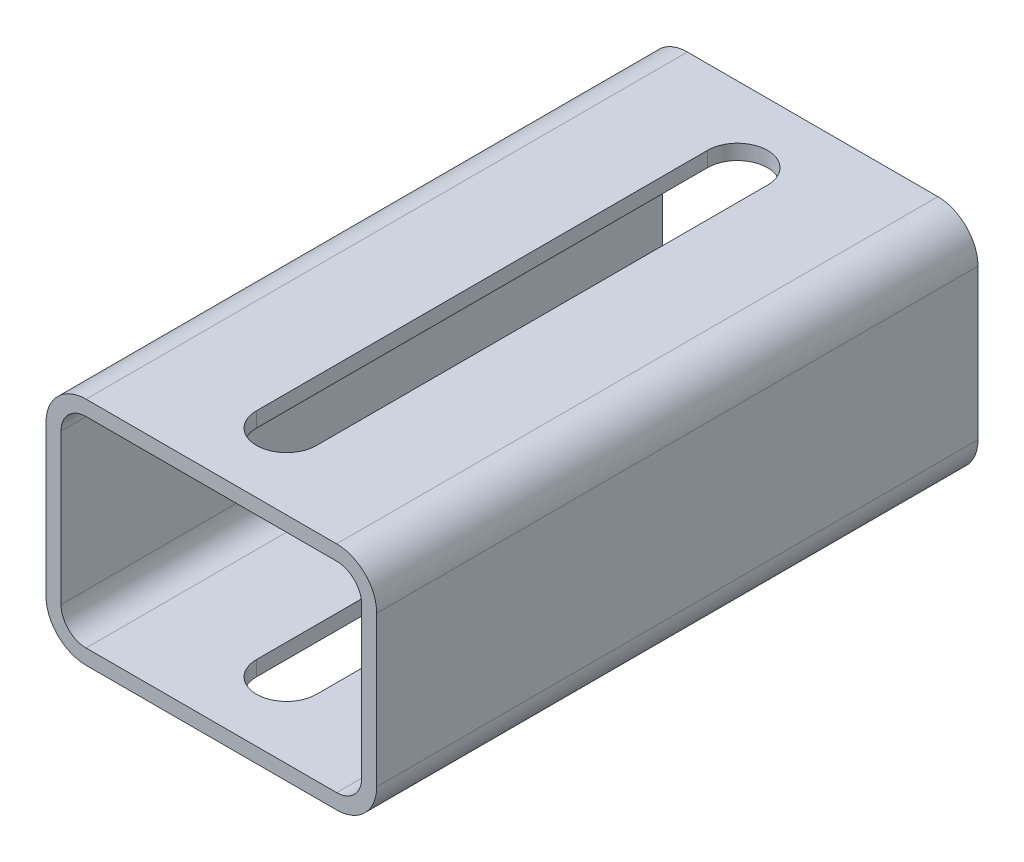
ISO-10303-21;
HEADER;
FILE_DESCRIPTION(('STEP AP214'),'2;1');
FILE_NAME('part.step','',(''),(''),'','','');
FILE_SCHEMA(('AUTOMOTIVE_DESIGN { 1 0 10303 214 1 1 1 1 }'));
ENDSEC;
DATA;
#1=APPLICATION_CONTEXT('core data for automotive mechanical design processes');
#2=APPLICATION_PROTOCOL_DEFINITION('international standard','automotive_design',2000,#1);
#3=PRODUCT_CONTEXT('',#1,'mechanical');
#4=PRODUCT('Part','Part','',(#3));
#5=PRODUCT_RELATED_PRODUCT_CATEGORY('part','',(#4));
#6=PRODUCT_DEFINITION_FORMATION('','',#4);
#7=PRODUCT_DEFINITION_CONTEXT('part definition',#1,'design');
#8=PRODUCT_DEFINITION('design','',#6,#7);
#9=PRODUCT_DEFINITION_SHAPE('','',#8);
#10=(LENGTH_UNIT() NAMED_UNIT(*) SI_UNIT(.MILLI.,.METRE.));
#11=(NAMED_UNIT(*) PLANE_ANGLE_UNIT() SI_UNIT($,.RADIAN.));
#12=(NAMED_UNIT(*) SI_UNIT($,.STERADIAN.) SOLID_ANGLE_UNIT());
#13=UNCERTAINTY_MEASURE_WITH_UNIT(LENGTH_MEASURE(1.E-05),#10,'distance_accuracy_value','');
#14=(GEOMETRIC_REPRESENTATION_CONTEXT(3) GLOBAL_UNCERTAINTY_ASSIGNED_CONTEXT((#13)) GLOBAL_UNIT_ASSIGNED_CONTEXT((#10,
#11,#12)) REPRESENTATION_CONTEXT('',''));
#15=CARTESIAN_POINT('',(0.,0.,0.));
#16=DIRECTION('',(0.,0.,1.));
#17=DIRECTION('',(1.,0.,0.));
#18=AXIS2_PLACEMENT_3D('',#15,#16,#17);
#19=CARTESIAN_POINT('',(-25.,15.,60.));
#20=DIRECTION('',(0.,0.,1.));
#21=DIRECTION('',(1.,0.,0.));
#22=AXIS2_PLACEMENT_3D('',#19,#20,#21);
#23=PLANE('',#22);
#24=CARTESIAN_POINT('',(-25.,15.,60.));
#25=DIRECTION('',(0.,0.,1.));
#26=DIRECTION('',(1.,0.,0.));
#27=AXIS2_PLACEMENT_3D('',#24,#25,#26);
#28=CIRCLE('',#27,8.);
#29=CARTESIAN_POINT('',(-25.,23.,60.));
#30=VERTEX_POINT('',#29);
#31=CARTESIAN_POINT('',(-33.,15.,60.));
#32=VERTEX_POINT('',#31);
#33=EDGE_CURVE('E403',#30,#32,#28,.T.);
#34=ORIENTED_EDGE('',*,*,#33,.T.);
#35=DIRECTION('',(0.,-1.,0.));
#36=VECTOR('',#35,1.);
#37=CARTESIAN_POINT('',(-33.,15.,60.));
#38=LINE('',#37,#36);
#39=CARTESIAN_POINT('',(-33.,-15.,60.));
#40=VERTEX_POINT('',#39);
#41=EDGE_CURVE('E407',#32,#40,#38,.T.);
#42=ORIENTED_EDGE('',*,*,#41,.T.);
#43=CARTESIAN_POINT('',(-25.,-15.,60.));
#44=DIRECTION('',(0.,0.,1.));
#45=DIRECTION('',(1.,0.,0.));
#46=AXIS2_PLACEMENT_3D('',#43,#44,#45);
#47=CIRCLE('',#46,8.);
#48=CARTESIAN_POINT('',(-25.,-23.,60.));
#49=VERTEX_POINT('',#48);
#50=EDGE_CURVE('E411',#40,#49,#47,.T.);
#51=ORIENTED_EDGE('',*,*,#50,.T.);
#52=DIRECTION('',(1.,0.,0.));
#53=VECTOR('',#52,1.);
#54=CARTESIAN_POINT('',(-25.,-23.,60.));
#55=LINE('',#54,#53);
#56=CARTESIAN_POINT('',(25.,-23.,60.));
#57=VERTEX_POINT('',#56);
#58=EDGE_CURVE('E414',#49,#57,#55,.T.);
#59=ORIENTED_EDGE('',*,*,#58,.T.);
#60=CARTESIAN_POINT('',(25.,-15.,60.));
#61=DIRECTION('',(0.,0.,1.));
#62=DIRECTION('',(1.,0.,0.));
#63=AXIS2_PLACEMENT_3D('',#60,#61,#62);
#64=CIRCLE('',#63,8.);
#65=CARTESIAN_POINT('',(33.,-15.,60.));
#66=VERTEX_POINT('',#65);
#67=EDGE_CURVE('E417',#57,#66,#64,.T.);
#68=ORIENTED_EDGE('',*,*,#67,.T.);
#69=DIRECTION('',(0.,1.,0.));
#70=VECTOR('',#69,1.);
#71=CARTESIAN_POINT('',(33.,15.,60.));
#72=LINE('',#71,#70);
#73=CARTESIAN_POINT('',(33.,15.,60.));
#74=VERTEX_POINT('',#73);
#75=EDGE_CURVE('E420',#66,#74,#72,.T.);
#76=ORIENTED_EDGE('',*,*,#75,.T.);
#77=CARTESIAN_POINT('',(25.,15.,60.));
#78=DIRECTION('',(0.,0.,1.));
#79=DIRECTION('',(1.,0.,0.));
#80=AXIS2_PLACEMENT_3D('',#77,#78,#79);
#81=CIRCLE('',#80,8.);
#82=CARTESIAN_POINT('',(25.,23.,60.));
#83=VERTEX_POINT('',#82);
#84=EDGE_CURVE('E423',#74,#83,#81,.T.);
#85=ORIENTED_EDGE('',*,*,#84,.T.);
#86=DIRECTION('',(-1.,0.,0.));
#87=VECTOR('',#86,1.);
#88=CARTESIAN_POINT('',(-25.,23.,60.));
#89=LINE('',#88,#87);
#90=EDGE_CURVE('E426',#83,#30,#89,.T.);
#91=ORIENTED_EDGE('',*,*,#90,.T.);
#92=EDGE_LOOP('',(#34,#42,#51,#59,#68,#76,#85,#91));
#93=FACE_BOUND('',#92,.T.);
#94=DIRECTION('',(0.,-1.,0.));
#95=VECTOR('',#94,1.);
#96=CARTESIAN_POINT('',(-30.,15.,60.));
#97=LINE('',#96,#95);
#98=CARTESIAN_POINT('',(-30.,15.,60.));
#99=VERTEX_POINT('',#98);
#100=CARTESIAN_POINT('',(-30.,-15.,60.));
#101=VERTEX_POINT('',#100);
#102=EDGE_CURVE('E323',#99,#101,#97,.T.);
#103=ORIENTED_EDGE('',*,*,#102,.F.);
#104=CARTESIAN_POINT('',(-25.,15.,60.));
#105=DIRECTION('',(0.,0.,1.));
#106=DIRECTION('',(1.,0.,0.));
#107=AXIS2_PLACEMENT_3D('',#104,#105,#106);
#108=CIRCLE('',#107,5.);
#109=CARTESIAN_POINT('',(-25.,20.,60.));
#110=VERTEX_POINT('',#109);
#111=EDGE_CURVE('E320',#110,#99,#108,.T.);
#112=ORIENTED_EDGE('',*,*,#111,.F.);
#113=DIRECTION('',(-1.,0.,0.));
#114=VECTOR('',#113,1.);
#115=CARTESIAN_POINT('',(-25.,20.,60.));
#116=LINE('',#115,#114);
#117=CARTESIAN_POINT('',(25.,20.,60.));
#118=VERTEX_POINT('',#117);
#119=EDGE_CURVE('E343',#118,#110,#116,.T.);
#120=ORIENTED_EDGE('',*,*,#119,.F.);
#121=CARTESIAN_POINT('',(25.,15.,60.));
#122=DIRECTION('',(0.,0.,1.));
#123=DIRECTION('',(-1.,0.,0.));
#124=AXIS2_PLACEMENT_3D('',#121,#122,#123);
#125=CIRCLE('',#124,5.);
#126=CARTESIAN_POINT('',(30.,15.,60.));
#127=VERTEX_POINT('',#126);
#128=EDGE_CURVE('E339',#127,#118,#125,.T.);
#129=ORIENTED_EDGE('',*,*,#128,.F.);
#130=DIRECTION('',(0.,1.,0.));
#131=VECTOR('',#130,1.);
#132=CARTESIAN_POINT('',(30.,15.,60.));
#133=LINE('',#132,#131);
#134=CARTESIAN_POINT('',(30.,-15.,60.));
#135=VERTEX_POINT('',#134);
#136=EDGE_CURVE('E336',#135,#127,#133,.T.);
#137=ORIENTED_EDGE('',*,*,#136,.F.);
#138=CARTESIAN_POINT('',(25.,-15.,60.));
#139=DIRECTION('',(0.,0.,1.));
#140=DIRECTION('',(1.,0.,0.));
#141=AXIS2_PLACEMENT_3D('',#138,#139,#140);
#142=CIRCLE('',#141,5.);
#143=CARTESIAN_POINT('',(25.,-20.,60.));
#144=VERTEX_POINT('',#143);
#145=EDGE_CURVE('E333',#144,#135,#142,.T.);
#146=ORIENTED_EDGE('',*,*,#145,.F.);
#147=DIRECTION('',(1.,0.,0.));
#148=VECTOR('',#147,1.);
#149=CARTESIAN_POINT('',(-25.,-20.,60.));
#150=LINE('',#149,#148);
#151=CARTESIAN_POINT('',(-25.,-20.,60.));
#152=VERTEX_POINT('',#151);
#153=EDGE_CURVE('E330',#152,#144,#150,.T.);
#154=ORIENTED_EDGE('',*,*,#153,.F.);
#155=CARTESIAN_POINT('',(-25.,-15.,60.));
#156=DIRECTION('',(0.,0.,1.));
#157=DIRECTION('',(1.,0.,0.));
#158=AXIS2_PLACEMENT_3D('',#155,#156,#157);
#159=CIRCLE('',#158,5.);
#160=EDGE_CURVE('E327',#101,#152,#159,.T.);
#161=ORIENTED_EDGE('',*,*,#160,.F.);
#162=EDGE_LOOP('',(#103,#112,#120,#129,#137,#146,#154,#161));
#163=FACE_BOUND('',#162,.T.);
#164=ADVANCED_FACE('F87',(#93,#163),#23,.T.);
#165=CARTESIAN_POINT('',(-25.,15.,-60.));
#166=DIRECTION('',(0.,0.,1.));
#167=DIRECTION('',(1.,0.,0.));
#168=AXIS2_PLACEMENT_3D('',#165,#166,#167);
#169=PLANE('',#168);
#170=CARTESIAN_POINT('',(-25.,15.,-60.));
#171=DIRECTION('',(0.,0.,1.));
#172=DIRECTION('',(1.,0.,0.));
#173=AXIS2_PLACEMENT_3D('',#170,#171,#172);
#174=CIRCLE('',#173,8.);
#175=CARTESIAN_POINT('',(-25.,23.,-60.));
#176=VERTEX_POINT('',#175);
#177=CARTESIAN_POINT('',(-33.,15.,-60.));
#178=VERTEX_POINT('',#177);
#179=EDGE_CURVE('E402',#176,#178,#174,.T.);
#180=ORIENTED_EDGE('',*,*,#179,.F.);
#181=DIRECTION('',(-1.,0.,0.));
#182=VECTOR('',#181,1.);
#183=CARTESIAN_POINT('',(-25.,23.,-60.));
#184=LINE('',#183,#182);
#185=CARTESIAN_POINT('',(25.,23.,-60.));
#186=VERTEX_POINT('',#185);
#187=EDGE_CURVE('E408',#186,#176,#184,.T.);
#188=ORIENTED_EDGE('',*,*,#187,.F.);
#189=CARTESIAN_POINT('',(25.,15.,-60.));
#190=DIRECTION('',(0.,0.,1.));
#191=DIRECTION('',(1.,0.,0.));
#192=AXIS2_PLACEMENT_3D('',#189,#190,#191);
#193=CIRCLE('',#192,8.);
#194=CARTESIAN_POINT('',(33.,15.,-60.));
#195=VERTEX_POINT('',#194);
#196=EDGE_CURVE('E448',#195,#186,#193,.T.);
#197=ORIENTED_EDGE('',*,*,#196,.F.);
#198=DIRECTION('',(0.,1.,0.));
#199=VECTOR('',#198,1.);
#200=CARTESIAN_POINT('',(33.,15.,-60.));
#201=LINE('',#200,#199);
#202=CARTESIAN_POINT('',(33.,-15.,-60.));
#203=VERTEX_POINT('',#202);
#204=EDGE_CURVE('E445',#203,#195,#201,.T.);
#205=ORIENTED_EDGE('',*,*,#204,.F.);
#206=CARTESIAN_POINT('',(25.,-15.,-60.));
#207=DIRECTION('',(0.,0.,1.));
#208=DIRECTION('',(1.,0.,0.));
#209=AXIS2_PLACEMENT_3D('',#206,#207,#208);
#210=CIRCLE('',#209,8.);
#211=CARTESIAN_POINT('',(25.,-23.,-60.));
#212=VERTEX_POINT('',#211);
#213=EDGE_CURVE('E442',#212,#203,#210,.T.);
#214=ORIENTED_EDGE('',*,*,#213,.F.);
#215=DIRECTION('',(1.,0.,0.));
#216=VECTOR('',#215,1.);
#217=CARTESIAN_POINT('',(-25.,-23.,-60.));
#218=LINE('',#217,#216);
#219=CARTESIAN_POINT('',(-25.,-23.,-60.));
#220=VERTEX_POINT('',#219);
#221=EDGE_CURVE('E439',#220,#212,#218,.T.);
#222=ORIENTED_EDGE('',*,*,#221,.F.);
#223=CARTESIAN_POINT('',(-25.,-15.,-60.));
#224=DIRECTION('',(0.,0.,1.));
#225=DIRECTION('',(1.,0.,0.));
#226=AXIS2_PLACEMENT_3D('',#223,#224,#225);
#227=CIRCLE('',#226,8.);
#228=CARTESIAN_POINT('',(-33.,-15.,-60.));
#229=VERTEX_POINT('',#228);
#230=EDGE_CURVE('E436',#229,#220,#227,.T.);
#231=ORIENTED_EDGE('',*,*,#230,.F.);
#232=DIRECTION('',(0.,-1.,0.));
#233=VECTOR('',#232,1.);
#234=CARTESIAN_POINT('',(-33.,15.,-60.));
#235=LINE('',#234,#233);
#236=EDGE_CURVE('E433',#178,#229,#235,.T.);
#237=ORIENTED_EDGE('',*,*,#236,.F.);
#238=EDGE_LOOP('',(#180,#188,#197,#205,#214,#222,#231,#237));
#239=FACE_BOUND('',#238,.T.);
#240=CARTESIAN_POINT('',(-25.,15.,-60.));
#241=DIRECTION('',(0.,0.,1.));
#242=DIRECTION('',(1.,0.,0.));
#243=AXIS2_PLACEMENT_3D('',#240,#241,#242);
#244=CIRCLE('',#243,5.);
#245=CARTESIAN_POINT('',(-25.,20.,-60.));
#246=VERTEX_POINT('',#245);
#247=CARTESIAN_POINT('',(-30.,15.,-60.));
#248=VERTEX_POINT('',#247);
#249=EDGE_CURVE('E319',#246,#248,#244,.T.);
#250=ORIENTED_EDGE('',*,*,#249,.T.);
#251=DIRECTION('',(0.,-1.,0.));
#252=VECTOR('',#251,1.);
#253=CARTESIAN_POINT('',(-30.,15.,-60.));
#254=LINE('',#253,#252);
#255=CARTESIAN_POINT('',(-30.,-15.,-60.));
#256=VERTEX_POINT('',#255);
#257=EDGE_CURVE('E350',#248,#256,#254,.T.);
#258=ORIENTED_EDGE('',*,*,#257,.T.);
#259=CARTESIAN_POINT('',(-25.,-15.,-60.));
#260=DIRECTION('',(0.,0.,1.));
#261=DIRECTION('',(1.,0.,0.));
#262=AXIS2_PLACEMENT_3D('',#259,#260,#261);
#263=CIRCLE('',#262,5.);
#264=CARTESIAN_POINT('',(-25.,-20.,-60.));
#265=VERTEX_POINT('',#264);
#266=EDGE_CURVE('E354',#256,#265,#263,.T.);
#267=ORIENTED_EDGE('',*,*,#266,.T.);
#268=DIRECTION('',(1.,0.,0.));
#269=VECTOR('',#268,1.);
#270=CARTESIAN_POINT('',(-25.,-20.,-60.));
#271=LINE('',#270,#269);
#272=CARTESIAN_POINT('',(25.,-20.,-60.));
#273=VERTEX_POINT('',#272);
#274=EDGE_CURVE('E358',#265,#273,#271,.T.);
#275=ORIENTED_EDGE('',*,*,#274,.T.);
#276=CARTESIAN_POINT('',(25.,-15.,-60.));
#277=DIRECTION('',(0.,0.,1.));
#278=DIRECTION('',(1.,0.,0.));
#279=AXIS2_PLACEMENT_3D('',#276,#277,#278);
#280=CIRCLE('',#279,5.);
#281=CARTESIAN_POINT('',(30.,-15.,-60.));
#282=VERTEX_POINT('',#281);
#283=EDGE_CURVE('E362',#273,#282,#280,.T.);
#284=ORIENTED_EDGE('',*,*,#283,.T.);
#285=DIRECTION('',(0.,1.,0.));
#286=VECTOR('',#285,1.);
#287=CARTESIAN_POINT('',(30.,15.,-60.));
#288=LINE('',#287,#286);
#289=CARTESIAN_POINT('',(30.,15.,-60.));
#290=VERTEX_POINT('',#289);
#291=EDGE_CURVE('E366',#282,#290,#288,.T.);
#292=ORIENTED_EDGE('',*,*,#291,.T.);
#293=CARTESIAN_POINT('',(25.,15.,-60.));
#294=DIRECTION('',(0.,0.,1.));
#295=DIRECTION('',(-1.,0.,0.));
#296=AXIS2_PLACEMENT_3D('',#293,#294,#295);
#297=CIRCLE('',#296,5.);
#298=CARTESIAN_POINT('',(25.,20.,-60.));
#299=VERTEX_POINT('',#298);
#300=EDGE_CURVE('E370',#290,#299,#297,.T.);
#301=ORIENTED_EDGE('',*,*,#300,.T.);
#302=DIRECTION('',(-1.,0.,0.));
#303=VECTOR('',#302,1.);
#304=CARTESIAN_POINT('',(-25.,20.,-60.));
#305=LINE('',#304,#303);
#306=EDGE_CURVE('E324',#299,#246,#305,.T.);
#307=ORIENTED_EDGE('',*,*,#306,.T.);
#308=EDGE_LOOP('',(#250,#258,#267,#275,#284,#292,#301,#307));
#309=FACE_BOUND('',#308,.T.);
#310=ADVANCED_FACE('F531',(#239,#309),#169,.F.);
#311=CARTESIAN_POINT('',(-25.,15.,60.));
#312=DIRECTION('',(0.,0.,-1.));
#313=DIRECTION('',(-1.,0.,0.));
#314=AXIS2_PLACEMENT_3D('',#311,#312,#313);
#315=CYLINDRICAL_SURFACE('',#314,8.);
#316=ORIENTED_EDGE('',*,*,#179,.T.);
#317=DIRECTION('',(0.,0.,-1.));
#318=VECTOR('',#317,1.);
#319=CARTESIAN_POINT('',(-33.,15.,60.));
#320=LINE('',#319,#318);
#321=EDGE_CURVE('E480',#32,#178,#320,.T.);
#322=ORIENTED_EDGE('',*,*,#321,.F.);
#323=ORIENTED_EDGE('',*,*,#33,.F.);
#324=DIRECTION('',(0.,0.,-1.));
#325=VECTOR('',#324,1.);
#326=CARTESIAN_POINT('',(-25.,23.,60.));
#327=LINE('',#326,#325);
#328=EDGE_CURVE('E429',#30,#176,#327,.T.);
#329=ORIENTED_EDGE('',*,*,#328,.T.);
#330=EDGE_LOOP('',(#316,#322,#323,#329));
#331=FACE_BOUND('',#330,.T.);
#332=ADVANCED_FACE('F89',(#331),#315,.T.);
#333=CARTESIAN_POINT('',(-33.,15.,60.));
#334=DIRECTION('',(1.,0.,0.));
#335=DIRECTION('',(0.,0.,-1.));
#336=AXIS2_PLACEMENT_3D('',#333,#334,#335);
#337=PLANE('',#336);
#338=ORIENTED_EDGE('',*,*,#236,.T.);
#339=DIRECTION('',(0.,0.,-1.));
#340=VECTOR('',#339,1.);
#341=CARTESIAN_POINT('',(-33.,-15.,60.));
#342=LINE('',#341,#340);
#343=EDGE_CURVE('E476',#40,#229,#342,.T.);
#344=ORIENTED_EDGE('',*,*,#343,.F.);
#345=ORIENTED_EDGE('',*,*,#41,.F.);
#346=ORIENTED_EDGE('',*,*,#321,.T.);
#347=EDGE_LOOP('',(#338,#344,#345,#346));
#348=FACE_BOUND('',#347,.T.);
#349=ADVANCED_FACE('F537',(#348),#337,.F.);
#350=CARTESIAN_POINT('',(-25.,-15.,60.));
#351=DIRECTION('',(0.,0.,-1.));
#352=DIRECTION('',(-1.,0.,0.));
#353=AXIS2_PLACEMENT_3D('',#350,#351,#352);
#354=CYLINDRICAL_SURFACE('',#353,8.);
#355=ORIENTED_EDGE('',*,*,#230,.T.);
#356=DIRECTION('',(0.,0.,-1.));
#357=VECTOR('',#356,1.);
#358=CARTESIAN_POINT('',(-25.,-23.,60.));
#359=LINE('',#358,#357);
#360=EDGE_CURVE('E472',#49,#220,#359,.T.);
#361=ORIENTED_EDGE('',*,*,#360,.F.);
#362=ORIENTED_EDGE('',*,*,#50,.F.);
#363=ORIENTED_EDGE('',*,*,#343,.T.);
#364=EDGE_LOOP('',(#355,#361,#362,#363));
#365=FACE_BOUND('',#364,.T.);
#366=ADVANCED_FACE('F557',(#365),#354,.T.);
#367=CARTESIAN_POINT('',(-25.,-23.,60.));
#368=DIRECTION('',(0.,1.,0.));
#369=DIRECTION('',(0.,0.,1.));
#370=AXIS2_PLACEMENT_3D('',#367,#368,#369);
#371=PLANE('',#370);
#372=DIRECTION('',(0.,0.,-1.));
#373=VECTOR('',#372,1.);
#374=CARTESIAN_POINT('',(5.99999999999998,-23.,-45.));
#375=LINE('',#374,#373);
#376=CARTESIAN_POINT('',(5.99999999999998,-23.,45.));
#377=VERTEX_POINT('',#376);
#378=CARTESIAN_POINT('',(5.99999999999998,-23.,-45.));
#379=VERTEX_POINT('',#378);
#380=EDGE_CURVE('E275',#377,#379,#375,.T.);
#381=ORIENTED_EDGE('',*,*,#380,.T.);
#382=CARTESIAN_POINT('',(0.,-23.,-45.));
#383=DIRECTION('',(0.,1.,0.));
#384=DIRECTION('',(0.,0.,1.));
#385=AXIS2_PLACEMENT_3D('',#382,#383,#384);
#386=CIRCLE('',#385,6.);
#387=CARTESIAN_POINT('',(-6.00000000000002,-23.,-45.));
#388=VERTEX_POINT('',#387);
#389=EDGE_CURVE('E255',#379,#388,#386,.T.);
#390=ORIENTED_EDGE('',*,*,#389,.T.);
#391=DIRECTION('',(0.,0.,1.));
#392=VECTOR('',#391,1.);
#393=CARTESIAN_POINT('',(-6.00000000000002,-23.,-45.));
#394=LINE('',#393,#392);
#395=CARTESIAN_POINT('',(-6.00000000000002,-23.,45.));
#396=VERTEX_POINT('',#395);
#397=EDGE_CURVE('E266',#388,#396,#394,.T.);
#398=ORIENTED_EDGE('',*,*,#397,.T.);
#399=CARTESIAN_POINT('',(0.,-23.,45.));
#400=DIRECTION('',(0.,1.,0.));
#401=DIRECTION('',(0.,0.,1.));
#402=AXIS2_PLACEMENT_3D('',#399,#400,#401);
#403=CIRCLE('',#402,6.);
#404=EDGE_CURVE('E103',#396,#377,#403,.T.);
#405=ORIENTED_EDGE('',*,*,#404,.T.);
#406=EDGE_LOOP('',(#381,#390,#398,#405));
#407=FACE_BOUND('',#406,.T.);
#408=ORIENTED_EDGE('',*,*,#221,.T.);
#409=DIRECTION('',(0.,0.,-1.));
#410=VECTOR('',#409,1.);
#411=CARTESIAN_POINT('',(25.,-23.,60.));
#412=LINE('',#411,#410);
#413=EDGE_CURVE('E468',#57,#212,#412,.T.);
#414=ORIENTED_EDGE('',*,*,#413,.F.);
#415=ORIENTED_EDGE('',*,*,#58,.F.);
#416=ORIENTED_EDGE('',*,*,#360,.T.);
#417=EDGE_LOOP('',(#408,#414,#415,#416));
#418=FACE_BOUND('',#417,.T.);
#419=ADVANCED_FACE('F272',(#407,#418),#371,.F.);
#420=CARTESIAN_POINT('',(25.,-15.,60.));
#421=DIRECTION('',(0.,0.,-1.));
#422=DIRECTION('',(-1.,0.,0.));
#423=AXIS2_PLACEMENT_3D('',#420,#421,#422);
#424=CYLINDRICAL_SURFACE('',#423,8.);
#425=ORIENTED_EDGE('',*,*,#213,.T.);
#426=DIRECTION('',(0.,0.,-1.));
#427=VECTOR('',#426,1.);
#428=CARTESIAN_POINT('',(33.,-15.,60.));
#429=LINE('',#428,#427);
#430=EDGE_CURVE('E464',#66,#203,#429,.T.);
#431=ORIENTED_EDGE('',*,*,#430,.F.);
#432=ORIENTED_EDGE('',*,*,#67,.F.);
#433=ORIENTED_EDGE('',*,*,#413,.T.);
#434=EDGE_LOOP('',(#425,#431,#432,#433));
#435=FACE_BOUND('',#434,.T.);
#436=ADVANCED_FACE('F552',(#435),#424,.T.);
#437=CARTESIAN_POINT('',(33.,15.,60.));
#438=DIRECTION('',(-1.,0.,0.));
#439=DIRECTION('',(0.,-1.,0.));
#440=AXIS2_PLACEMENT_3D('',#437,#438,#439);
#441=PLANE('',#440);
#442=ORIENTED_EDGE('',*,*,#204,.T.);
#443=DIRECTION('',(0.,0.,-1.));
#444=VECTOR('',#443,1.);
#445=CARTESIAN_POINT('',(33.,15.,60.));
#446=LINE('',#445,#444);
#447=EDGE_CURVE('E460',#74,#195,#446,.T.);
#448=ORIENTED_EDGE('',*,*,#447,.F.);
#449=ORIENTED_EDGE('',*,*,#75,.F.);
#450=ORIENTED_EDGE('',*,*,#430,.T.);
#451=EDGE_LOOP('',(#442,#448,#449,#450));
#452=FACE_BOUND('',#451,.T.);
#453=ADVANCED_FACE('F548',(#452),#441,.F.);
#454=CARTESIAN_POINT('',(25.,15.,60.));
#455=DIRECTION('',(0.,0.,-1.));
#456=DIRECTION('',(-1.,0.,0.));
#457=AXIS2_PLACEMENT_3D('',#454,#455,#456);
#458=CYLINDRICAL_SURFACE('',#457,8.);
#459=ORIENTED_EDGE('',*,*,#196,.T.);
#460=DIRECTION('',(0.,0.,-1.));
#461=VECTOR('',#460,1.);
#462=CARTESIAN_POINT('',(25.,23.,60.));
#463=LINE('',#462,#461);
#464=EDGE_CURVE('E456',#83,#186,#463,.T.);
#465=ORIENTED_EDGE('',*,*,#464,.F.);
#466=ORIENTED_EDGE('',*,*,#84,.F.);
#467=ORIENTED_EDGE('',*,*,#447,.T.);
#468=EDGE_LOOP('',(#459,#465,#466,#467));
#469=FACE_BOUND('',#468,.T.);
#470=ADVANCED_FACE('F519',(#469),#458,.T.);
#471=CARTESIAN_POINT('',(-25.,23.,60.));
#472=DIRECTION('',(0.,-1.,0.));
#473=DIRECTION('',(0.,0.,-1.));
#474=AXIS2_PLACEMENT_3D('',#471,#472,#473);
#475=PLANE('',#474);
#476=DIRECTION('',(0.,0.,1.));
#477=VECTOR('',#476,1.);
#478=CARTESIAN_POINT('',(-6.00000000000002,23.,-45.));
#479=LINE('',#478,#477);
#480=CARTESIAN_POINT('',(-6.00000000000002,23.,-45.));
#481=VERTEX_POINT('',#480);
#482=CARTESIAN_POINT('',(-5.99999999999999,23.,45.));
#483=VERTEX_POINT('',#482);
#484=EDGE_CURVE('E290',#481,#483,#479,.T.);
#485=ORIENTED_EDGE('',*,*,#484,.F.);
#486=CARTESIAN_POINT('',(0.,23.,-45.));
#487=DIRECTION('',(0.,1.,0.));
#488=DIRECTION('',(0.,0.,1.));
#489=AXIS2_PLACEMENT_3D('',#486,#487,#488);
#490=CIRCLE('',#489,6.);
#491=CARTESIAN_POINT('',(5.99999999999998,23.,-45.));
#492=VERTEX_POINT('',#491);
#493=EDGE_CURVE('E111',#492,#481,#490,.T.);
#494=ORIENTED_EDGE('',*,*,#493,.F.);
#495=DIRECTION('',(0.,0.,-1.));
#496=VECTOR('',#495,1.);
#497=CARTESIAN_POINT('',(5.99999999999998,23.,-45.));
#498=LINE('',#497,#496);
#499=CARTESIAN_POINT('',(5.99999999999998,23.,45.));
#500=VERTEX_POINT('',#499);
#501=EDGE_CURVE('E277',#500,#492,#498,.T.);
#502=ORIENTED_EDGE('',*,*,#501,.F.);
#503=CARTESIAN_POINT('',(0.,23.,45.));
#504=DIRECTION('',(0.,1.,0.));
#505=DIRECTION('',(0.,0.,1.));
#506=AXIS2_PLACEMENT_3D('',#503,#504,#505);
#507=CIRCLE('',#506,6.);
#508=EDGE_CURVE('E281',#483,#500,#507,.T.);
#509=ORIENTED_EDGE('',*,*,#508,.F.);
#510=EDGE_LOOP('',(#485,#494,#502,#509));
#511=FACE_BOUND('',#510,.T.);
#512=ORIENTED_EDGE('',*,*,#187,.T.);
#513=ORIENTED_EDGE('',*,*,#328,.F.);
#514=ORIENTED_EDGE('',*,*,#90,.F.);
#515=ORIENTED_EDGE('',*,*,#464,.T.);
#516=EDGE_LOOP('',(#512,#513,#514,#515));
#517=FACE_BOUND('',#516,.T.);
#518=ADVANCED_FACE('F515',(#511,#517),#475,.F.);
#519=CARTESIAN_POINT('',(-25.,15.,60.));
#520=DIRECTION('',(0.,0.,-1.));
#521=DIRECTION('',(-1.,0.,0.));
#522=AXIS2_PLACEMENT_3D('',#519,#520,#521);
#523=CYLINDRICAL_SURFACE('',#522,5.);
#524=ORIENTED_EDGE('',*,*,#249,.F.);
#525=DIRECTION('',(0.,0.,-1.));
#526=VECTOR('',#525,1.);
#527=CARTESIAN_POINT('',(-25.,20.,60.));
#528=LINE('',#527,#526);
#529=EDGE_CURVE('E346',#110,#246,#528,.T.);
#530=ORIENTED_EDGE('',*,*,#529,.F.);
#531=ORIENTED_EDGE('',*,*,#111,.T.);
#532=DIRECTION('',(0.,0.,-1.));
#533=VECTOR('',#532,1.);
#534=CARTESIAN_POINT('',(-30.,15.,60.));
#535=LINE('',#534,#533);
#536=EDGE_CURVE('E398',#99,#248,#535,.T.);
#537=ORIENTED_EDGE('',*,*,#536,.T.);
#538=EDGE_LOOP('',(#524,#530,#531,#537));
#539=FACE_BOUND('',#538,.T.);
#540=ADVANCED_FACE('F518',(#539),#523,.F.);
#541=CARTESIAN_POINT('',(-30.,15.,60.));
#542=DIRECTION('',(1.,0.,0.));
#543=DIRECTION('',(0.,0.,-1.));
#544=AXIS2_PLACEMENT_3D('',#541,#542,#543);
#545=PLANE('',#544);
#546=ORIENTED_EDGE('',*,*,#257,.F.);
#547=ORIENTED_EDGE('',*,*,#536,.F.);
#548=ORIENTED_EDGE('',*,*,#102,.T.);
#549=DIRECTION('',(0.,0.,-1.));
#550=VECTOR('',#549,1.);
#551=CARTESIAN_POINT('',(-30.,-15.,60.));
#552=LINE('',#551,#550);
#553=EDGE_CURVE('E395',#101,#256,#552,.T.);
#554=ORIENTED_EDGE('',*,*,#553,.T.);
#555=EDGE_LOOP('',(#546,#547,#548,#554));
#556=FACE_BOUND('',#555,.T.);
#557=ADVANCED_FACE('F602',(#556),#545,.T.);
#558=CARTESIAN_POINT('',(-25.,-15.,60.));
#559=DIRECTION('',(0.,0.,-1.));
#560=DIRECTION('',(-1.,0.,0.));
#561=AXIS2_PLACEMENT_3D('',#558,#559,#560);
#562=CYLINDRICAL_SURFACE('',#561,5.);
#563=ORIENTED_EDGE('',*,*,#266,.F.);
#564=ORIENTED_EDGE('',*,*,#553,.F.);
#565=ORIENTED_EDGE('',*,*,#160,.T.);
#566=DIRECTION('',(0.,0.,-1.));
#567=VECTOR('',#566,1.);
#568=CARTESIAN_POINT('',(-25.,-20.,60.));
#569=LINE('',#568,#567);
#570=EDGE_CURVE('E392',#152,#265,#569,.T.);
#571=ORIENTED_EDGE('',*,*,#570,.T.);
#572=EDGE_LOOP('',(#563,#564,#565,#571));
#573=FACE_BOUND('',#572,.T.);
#574=ADVANCED_FACE('F609',(#573),#562,.F.);
#575=CARTESIAN_POINT('',(-25.,-20.,60.));
#576=DIRECTION('',(0.,1.,0.));
#577=DIRECTION('',(0.,0.,1.));
#578=AXIS2_PLACEMENT_3D('',#575,#576,#577);
#579=PLANE('',#578);
#580=CARTESIAN_POINT('',(0.,-20.,-45.));
#581=DIRECTION('',(0.,1.,0.));
#582=DIRECTION('',(0.,0.,1.));
#583=AXIS2_PLACEMENT_3D('',#580,#581,#582);
#584=CIRCLE('',#583,6.);
#585=CARTESIAN_POINT('',(5.99999999999998,-20.,-45.));
#586=VERTEX_POINT('',#585);
#587=CARTESIAN_POINT('',(-6.00000000000002,-20.,-45.));
#588=VERTEX_POINT('',#587);
#589=EDGE_CURVE('E258',#586,#588,#584,.T.);
#590=ORIENTED_EDGE('',*,*,#589,.F.);
#591=DIRECTION('',(0.,0.,-1.));
#592=VECTOR('',#591,1.);
#593=CARTESIAN_POINT('',(5.99999999999998,-20.,60.));
#594=LINE('',#593,#592);
#595=CARTESIAN_POINT('',(5.99999999999998,-20.,45.));
#596=VERTEX_POINT('',#595);
#597=EDGE_CURVE('E314',#596,#586,#594,.T.);
#598=ORIENTED_EDGE('',*,*,#597,.F.);
#599=CARTESIAN_POINT('',(0.,-20.,45.));
#600=DIRECTION('',(0.,1.,0.));
#601=DIRECTION('',(0.,0.,1.));
#602=AXIS2_PLACEMENT_3D('',#599,#600,#601);
#603=CIRCLE('',#602,6.);
#604=CARTESIAN_POINT('',(-5.99999999999999,-20.,45.));
#605=VERTEX_POINT('',#604);
#606=EDGE_CURVE('E311',#605,#596,#603,.T.);
#607=ORIENTED_EDGE('',*,*,#606,.F.);
#608=DIRECTION('',(0.,0.,1.));
#609=VECTOR('',#608,1.);
#610=CARTESIAN_POINT('',(-6.00000000000002,-20.,60.));
#611=LINE('',#610,#609);
#612=EDGE_CURVE('E300',#588,#605,#611,.T.);
#613=ORIENTED_EDGE('',*,*,#612,.F.);
#614=EDGE_LOOP('',(#590,#598,#607,#613));
#615=FACE_BOUND('',#614,.T.);
#616=ORIENTED_EDGE('',*,*,#274,.F.);
#617=ORIENTED_EDGE('',*,*,#570,.F.);
#618=ORIENTED_EDGE('',*,*,#153,.T.);
#619=DIRECTION('',(0.,0.,-1.));
#620=VECTOR('',#619,1.);
#621=CARTESIAN_POINT('',(25.,-20.,60.));
#622=LINE('',#621,#620);
#623=EDGE_CURVE('E389',#144,#273,#622,.T.);
#624=ORIENTED_EDGE('',*,*,#623,.T.);
#625=EDGE_LOOP('',(#616,#617,#618,#624));
#626=FACE_BOUND('',#625,.T.);
#627=ADVANCED_FACE('F616',(#615,#626),#579,.T.);
#628=CARTESIAN_POINT('',(25.,-15.,60.));
#629=DIRECTION('',(0.,0.,-1.));
#630=DIRECTION('',(-1.,0.,0.));
#631=AXIS2_PLACEMENT_3D('',#628,#629,#630);
#632=CYLINDRICAL_SURFACE('',#631,5.);
#633=ORIENTED_EDGE('',*,*,#283,.F.);
#634=ORIENTED_EDGE('',*,*,#623,.F.);
#635=ORIENTED_EDGE('',*,*,#145,.T.);
#636=DIRECTION('',(0.,0.,-1.));
#637=VECTOR('',#636,1.);
#638=CARTESIAN_POINT('',(30.,-15.,60.));
#639=LINE('',#638,#637);
#640=EDGE_CURVE('E386',#135,#282,#639,.T.);
#641=ORIENTED_EDGE('',*,*,#640,.T.);
#642=EDGE_LOOP('',(#633,#634,#635,#641));
#643=FACE_BOUND('',#642,.T.);
#644=ADVANCED_FACE('F624',(#643),#632,.F.);
#645=CARTESIAN_POINT('',(30.,15.,60.));
#646=DIRECTION('',(-1.,0.,0.));
#647=DIRECTION('',(0.,-1.,0.));
#648=AXIS2_PLACEMENT_3D('',#645,#646,#647);
#649=PLANE('',#648);
#650=ORIENTED_EDGE('',*,*,#291,.F.);
#651=ORIENTED_EDGE('',*,*,#640,.F.);
#652=ORIENTED_EDGE('',*,*,#136,.T.);
#653=DIRECTION('',(0.,0.,-1.));
#654=VECTOR('',#653,1.);
#655=CARTESIAN_POINT('',(30.,15.,60.));
#656=LINE('',#655,#654);
#657=EDGE_CURVE('E383',#127,#290,#656,.T.);
#658=ORIENTED_EDGE('',*,*,#657,.T.);
#659=EDGE_LOOP('',(#650,#651,#652,#658));
#660=FACE_BOUND('',#659,.T.);
#661=ADVANCED_FACE('F632',(#660),#649,.T.);
#662=CARTESIAN_POINT('',(25.,15.,60.));
#663=DIRECTION('',(0.,0.,-1.));
#664=DIRECTION('',(-1.,0.,0.));
#665=AXIS2_PLACEMENT_3D('',#662,#663,#664);
#666=CYLINDRICAL_SURFACE('',#665,5.);
#667=ORIENTED_EDGE('',*,*,#300,.F.);
#668=ORIENTED_EDGE('',*,*,#657,.F.);
#669=ORIENTED_EDGE('',*,*,#128,.T.);
#670=DIRECTION('',(0.,0.,-1.));
#671=VECTOR('',#670,1.);
#672=CARTESIAN_POINT('',(25.,20.,60.));
#673=LINE('',#672,#671);
#674=EDGE_CURVE('E380',#118,#299,#673,.T.);
#675=ORIENTED_EDGE('',*,*,#674,.T.);
#676=EDGE_LOOP('',(#667,#668,#669,#675));
#677=FACE_BOUND('',#676,.T.);
#678=ADVANCED_FACE('F640',(#677),#666,.F.);
#679=CARTESIAN_POINT('',(-25.,20.,60.));
#680=DIRECTION('',(0.,-1.,0.));
#681=DIRECTION('',(0.,0.,-1.));
#682=AXIS2_PLACEMENT_3D('',#679,#680,#681);
#683=PLANE('',#682);
#684=CARTESIAN_POINT('',(0.,20.,-45.));
#685=DIRECTION('',(0.,-1.,0.));
#686=DIRECTION('',(0.,0.,-1.));
#687=AXIS2_PLACEMENT_3D('',#684,#685,#686);
#688=CIRCLE('',#687,6.);
#689=CARTESIAN_POINT('',(-6.00000000000002,20.,-45.));
#690=VERTEX_POINT('',#689);
#691=CARTESIAN_POINT('',(5.99999999999998,20.,-45.));
#692=VERTEX_POINT('',#691);
#693=EDGE_CURVE('E12',#690,#692,#688,.T.);
#694=ORIENTED_EDGE('',*,*,#693,.F.);
#695=DIRECTION('',(0.,0.,-1.));
#696=VECTOR('',#695,1.);
#697=CARTESIAN_POINT('',(-6.00000000000002,20.,60.));
#698=LINE('',#697,#696);
#699=CARTESIAN_POINT('',(-6.00000000000002,20.,45.));
#700=VERTEX_POINT('',#699);
#701=EDGE_CURVE('E484',#700,#690,#698,.T.);
#702=ORIENTED_EDGE('',*,*,#701,.F.);
#703=CARTESIAN_POINT('',(0.,20.,45.));
#704=DIRECTION('',(0.,-1.,0.));
#705=DIRECTION('',(0.,0.,-1.));
#706=AXIS2_PLACEMENT_3D('',#703,#704,#705);
#707=CIRCLE('',#706,6.);
#708=CARTESIAN_POINT('',(5.99999999999998,20.,45.));
#709=VERTEX_POINT('',#708);
#710=EDGE_CURVE('E487',#709,#700,#707,.T.);
#711=ORIENTED_EDGE('',*,*,#710,.F.);
#712=DIRECTION('',(0.,0.,1.));
#713=VECTOR('',#712,1.);
#714=CARTESIAN_POINT('',(5.99999999999998,20.,60.));
#715=LINE('',#714,#713);
#716=EDGE_CURVE('E96',#692,#709,#715,.T.);
#717=ORIENTED_EDGE('',*,*,#716,.F.);
#718=EDGE_LOOP('',(#694,#702,#711,#717));
#719=FACE_BOUND('',#718,.T.);
#720=ORIENTED_EDGE('',*,*,#306,.F.);
#721=ORIENTED_EDGE('',*,*,#674,.F.);
#722=ORIENTED_EDGE('',*,*,#119,.T.);
#723=ORIENTED_EDGE('',*,*,#529,.T.);
#724=EDGE_LOOP('',(#720,#721,#722,#723));
#725=FACE_BOUND('',#724,.T.);
#726=ADVANCED_FACE('F505',(#719,#725),#683,.T.);
#727=CARTESIAN_POINT('',(-6.00000000000002,-23.,-45.));
#728=DIRECTION('',(-1.,0.,0.));
#729=DIRECTION('',(0.,0.,1.));
#730=AXIS2_PLACEMENT_3D('',#727,#728,#729);
#731=PLANE('',#730);
#732=ORIENTED_EDGE('',*,*,#701,.T.);
#733=DIRECTION('',(0.,1.,0.));
#734=VECTOR('',#733,1.);
#735=CARTESIAN_POINT('',(-6.00000000000002,-23.,-45.));
#736=LINE('',#735,#734);
#737=EDGE_CURVE('E263',#690,#481,#736,.T.);
#738=ORIENTED_EDGE('',*,*,#737,.T.);
#739=ORIENTED_EDGE('',*,*,#484,.T.);
#740=DIRECTION('',(0.,1.,0.));
#741=VECTOR('',#740,1.);
#742=CARTESIAN_POINT('',(-5.99999999999999,-23.,45.));
#743=LINE('',#742,#741);
#744=EDGE_CURVE('E262',#700,#483,#743,.T.);
#745=ORIENTED_EDGE('',*,*,#744,.F.);
#746=EDGE_LOOP('',(#732,#738,#739,#745));
#747=FACE_BOUND('',#746,.T.);
#748=ADVANCED_FACE('F508',(#747),#731,.F.);
#749=CARTESIAN_POINT('',(0.,-23.,45.));
#750=DIRECTION('',(0.,1.,0.));
#751=DIRECTION('',(0.,0.,1.));
#752=AXIS2_PLACEMENT_3D('',#749,#750,#751);
#753=CYLINDRICAL_SURFACE('',#752,6.);
#754=ORIENTED_EDGE('',*,*,#710,.T.);
#755=ORIENTED_EDGE('',*,*,#744,.T.);
#756=ORIENTED_EDGE('',*,*,#508,.T.);
#757=DIRECTION('',(0.,1.,0.));
#758=VECTOR('',#757,1.);
#759=CARTESIAN_POINT('',(5.99999999999998,-23.,45.));
#760=LINE('',#759,#758);
#761=EDGE_CURVE('E306',#709,#500,#760,.T.);
#762=ORIENTED_EDGE('',*,*,#761,.F.);
#763=EDGE_LOOP('',(#754,#755,#756,#762));
#764=FACE_BOUND('',#763,.T.);
#765=ADVANCED_FACE('F500',(#764),#753,.F.);
#766=CARTESIAN_POINT('',(5.99999999999998,-23.,-45.));
#767=DIRECTION('',(1.,0.,0.));
#768=DIRECTION('',(0.,0.,-1.));
#769=AXIS2_PLACEMENT_3D('',#766,#767,#768);
#770=PLANE('',#769);
#771=ORIENTED_EDGE('',*,*,#716,.T.);
#772=ORIENTED_EDGE('',*,*,#761,.T.);
#773=ORIENTED_EDGE('',*,*,#501,.T.);
#774=DIRECTION('',(0.,1.,0.));
#775=VECTOR('',#774,1.);
#776=CARTESIAN_POINT('',(5.99999999999998,-23.,-45.));
#777=LINE('',#776,#775);
#778=EDGE_CURVE('E301',#692,#492,#777,.T.);
#779=ORIENTED_EDGE('',*,*,#778,.F.);
#780=EDGE_LOOP('',(#771,#772,#773,#779));
#781=FACE_BOUND('',#780,.T.);
#782=ADVANCED_FACE('F495',(#781),#770,.F.);
#783=CARTESIAN_POINT('',(0.,-23.,-45.));
#784=DIRECTION('',(0.,1.,0.));
#785=DIRECTION('',(0.,0.,1.));
#786=AXIS2_PLACEMENT_3D('',#783,#784,#785);
#787=CYLINDRICAL_SURFACE('',#786,6.);
#788=ORIENTED_EDGE('',*,*,#693,.T.);
#789=ORIENTED_EDGE('',*,*,#778,.T.);
#790=ORIENTED_EDGE('',*,*,#493,.T.);
#791=ORIENTED_EDGE('',*,*,#737,.F.);
#792=EDGE_LOOP('',(#788,#789,#790,#791));
#793=FACE_BOUND('',#792,.T.);
#794=ADVANCED_FACE('F510',(#793),#787,.F.);
#795=ORIENTED_EDGE('',*,*,#589,.T.);
#796=EDGE_CURVE('E250',#388,#588,#736,.T.);
#797=ORIENTED_EDGE('',*,*,#796,.F.);
#798=ORIENTED_EDGE('',*,*,#389,.F.);
#799=EDGE_CURVE('E297',#379,#586,#777,.T.);
#800=ORIENTED_EDGE('',*,*,#799,.T.);
#801=EDGE_LOOP('',(#795,#797,#798,#800));
#802=FACE_BOUND('',#801,.T.);
#803=ADVANCED_FACE('F252',(#802),#787,.F.);
#804=ORIENTED_EDGE('',*,*,#597,.T.);
#805=ORIENTED_EDGE('',*,*,#799,.F.);
#806=ORIENTED_EDGE('',*,*,#380,.F.);
#807=EDGE_CURVE('E302',#377,#596,#760,.T.);
#808=ORIENTED_EDGE('',*,*,#807,.T.);
#809=EDGE_LOOP('',(#804,#805,#806,#808));
#810=FACE_BOUND('',#809,.T.);
#811=ADVANCED_FACE('F674',(#810),#770,.F.);
#812=ORIENTED_EDGE('',*,*,#606,.T.);
#813=ORIENTED_EDGE('',*,*,#807,.F.);
#814=ORIENTED_EDGE('',*,*,#404,.F.);
#815=EDGE_CURVE('E268',#396,#605,#743,.T.);
#816=ORIENTED_EDGE('',*,*,#815,.T.);
#817=EDGE_LOOP('',(#812,#813,#814,#816));
#818=FACE_BOUND('',#817,.T.);
#819=ADVANCED_FACE('F667',(#818),#753,.F.);
#820=ORIENTED_EDGE('',*,*,#612,.T.);
#821=ORIENTED_EDGE('',*,*,#815,.F.);
#822=ORIENTED_EDGE('',*,*,#397,.F.);
#823=ORIENTED_EDGE('',*,*,#796,.T.);
#824=EDGE_LOOP('',(#820,#821,#822,#823));
#825=FACE_BOUND('',#824,.T.);
#826=ADVANCED_FACE('F267',(#825),#731,.F.);
#827=CLOSED_SHELL('',(#164,#310,#332,#349,#366,#419,#436,#453,#470,#518,#540,#557,#574,#627,
#644,#661,#678,#726,#748,#765,#782,#794,#803,#811,#819,#826));
#828=MANIFOLD_SOLID_BREP('B2',#827);
#829=ADVANCED_BREP_SHAPE_REPRESENTATION('',(#18,#828),#14);
#830=SHAPE_DEFINITION_REPRESENTATION(#9,#829);
ENDSEC;
END-ISO-10303-21;
